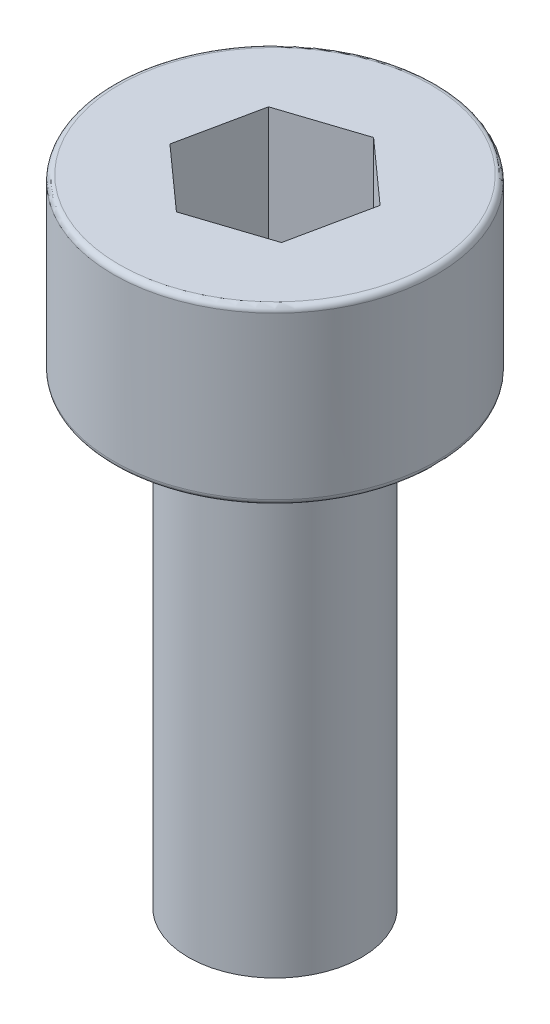
ISO-10303-21;
HEADER;
FILE_DESCRIPTION(('STEP AP214'),'2;1');
FILE_NAME('part.step','',(''),(''),'','','');
FILE_SCHEMA(('AUTOMOTIVE_DESIGN { 1 0 10303 214 1 1 1 1 }'));
ENDSEC;
DATA;
#1=APPLICATION_CONTEXT('core data for automotive mechanical design processes');
#2=APPLICATION_PROTOCOL_DEFINITION('international standard','automotive_design',2000,#1);
#3=PRODUCT_CONTEXT('',#1,'mechanical');
#4=PRODUCT('Part','Part','',(#3));
#5=PRODUCT_RELATED_PRODUCT_CATEGORY('part','',(#4));
#6=PRODUCT_DEFINITION_FORMATION('','',#4);
#7=PRODUCT_DEFINITION_CONTEXT('part definition',#1,'design');
#8=PRODUCT_DEFINITION('design','',#6,#7);
#9=PRODUCT_DEFINITION_SHAPE('','',#8);
#10=(LENGTH_UNIT() NAMED_UNIT(*) SI_UNIT(.MILLI.,.METRE.));
#11=(NAMED_UNIT(*) PLANE_ANGLE_UNIT() SI_UNIT($,.RADIAN.));
#12=(NAMED_UNIT(*) SI_UNIT($,.STERADIAN.) SOLID_ANGLE_UNIT());
#13=UNCERTAINTY_MEASURE_WITH_UNIT(LENGTH_MEASURE(1.E-05),#10,'distance_accuracy_value','');
#14=(GEOMETRIC_REPRESENTATION_CONTEXT(3) GLOBAL_UNCERTAINTY_ASSIGNED_CONTEXT((#13)) GLOBAL_UNIT_ASSIGNED_CONTEXT((#10,
#11,#12)) REPRESENTATION_CONTEXT('',''));
#15=CARTESIAN_POINT('',(0.,0.,0.));
#16=DIRECTION('',(0.,0.,1.));
#17=DIRECTION('',(1.,0.,0.));
#18=AXIS2_PLACEMENT_3D('',#15,#16,#17);
#19=CARTESIAN_POINT('',(1.5,0.,0.));
#20=DIRECTION('',(0.,-1.,0.));
#21=DIRECTION('',(0.,0.,-1.));
#22=AXIS2_PLACEMENT_3D('',#19,#20,#21);
#23=PLANE('',#22);
#24=CARTESIAN_POINT('',(0.,0.,0.));
#25=DIRECTION('',(0.,-1.,0.));
#26=DIRECTION('',(0.,0.,-1.));
#27=AXIS2_PLACEMENT_3D('',#24,#25,#26);
#28=CIRCLE('',#27,1.5);
#29=CARTESIAN_POINT('',(0.,0.,-1.5));
#30=VERTEX_POINT('',#29);
#31=EDGE_CURVE('E141',#30,#30,#28,.T.);
#32=ORIENTED_EDGE('',*,*,#31,.T.);
#33=EDGE_LOOP('',(#32));
#34=FACE_BOUND('',#33,.T.);
#35=ADVANCED_FACE('F39',(#34),#23,.T.);
#36=CARTESIAN_POINT('',(0.,11.,0.));
#37=DIRECTION('',(0.,1.,0.));
#38=DIRECTION('',(0.,0.,1.));
#39=AXIS2_PLACEMENT_3D('',#36,#37,#38);
#40=PLANE('',#39);
#41=CARTESIAN_POINT('',(0.,11.,0.));
#42=DIRECTION('',(0.,1.,0.));
#43=DIRECTION('',(0.,0.,1.));
#44=AXIS2_PLACEMENT_3D('',#41,#42,#43);
#45=CIRCLE('',#44,2.7);
#46=CARTESIAN_POINT('',(0.,11.,2.7));
#47=VERTEX_POINT('',#46);
#48=EDGE_CURVE('E11',#47,#47,#45,.T.);
#49=ORIENTED_EDGE('',*,*,#48,.T.);
#50=EDGE_LOOP('',(#49));
#51=FACE_BOUND('',#50,.T.);
#52=DIRECTION('',(0.950201049984198,0.,-0.311637553271309));
#53=VECTOR('',#52,1.);
#54=CARTESIAN_POINT('',(-0.296201598401666,11.,1.41265634406873));
#55=LINE('',#54,#53);
#56=CARTESIAN_POINT('',(-0.296201598401666,11.,1.41265634406873));
#57=VERTEX_POINT('',#56);
#58=CARTESIAN_POINT('',(1.07529548157994,11.,0.962846280891763));
#59=VERTEX_POINT('',#58);
#60=EDGE_CURVE('E54',#57,#59,#55,.T.);
#61=ORIENTED_EDGE('',*,*,#60,.F.);
#62=DIRECTION('',(0.744986562898279,0.,0.667079471353308));
#63=VECTOR('',#62,1.);
#64=CARTESIAN_POINT('',(-1.3714970799816,11.,0.449810063176967));
#65=LINE('',#64,#63);
#66=CARTESIAN_POINT('',(-1.3714970799816,11.,0.449810063176967));
#67=VERTEX_POINT('',#66);
#68=EDGE_CURVE('E137',#67,#57,#65,.T.);
#69=ORIENTED_EDGE('',*,*,#68,.F.);
#70=DIRECTION('',(-0.205214487085919,0.,0.978717024624617));
#71=VECTOR('',#70,1.);
#72=CARTESIAN_POINT('',(-1.07529548157994,11.,-0.962846280891764));
#73=LINE('',#72,#71);
#74=CARTESIAN_POINT('',(-1.07529548157994,11.,-0.962846280891764));
#75=VERTEX_POINT('',#74);
#76=EDGE_CURVE('E135',#75,#67,#73,.T.);
#77=ORIENTED_EDGE('',*,*,#76,.F.);
#78=DIRECTION('',(-0.950201049984198,0.,0.311637553271309));
#79=VECTOR('',#78,1.);
#80=CARTESIAN_POINT('',(0.296201598401666,11.,-1.41265634406873));
#81=LINE('',#80,#79);
#82=CARTESIAN_POINT('',(0.296201598401666,11.,-1.41265634406873));
#83=VERTEX_POINT('',#82);
#84=EDGE_CURVE('E102',#83,#75,#81,.T.);
#85=ORIENTED_EDGE('',*,*,#84,.F.);
#86=DIRECTION('',(-0.744986562898279,0.,-0.667079471353308));
#87=VECTOR('',#86,1.);
#88=CARTESIAN_POINT('',(1.3714970799816,11.,-0.449810063176967));
#89=LINE('',#88,#87);
#90=CARTESIAN_POINT('',(1.3714970799816,11.,-0.449810063176967));
#91=VERTEX_POINT('',#90);
#92=EDGE_CURVE('E131',#91,#83,#89,.T.);
#93=ORIENTED_EDGE('',*,*,#92,.F.);
#94=DIRECTION('',(0.205214487085918,0.,-0.978717024624617));
#95=VECTOR('',#94,1.);
#96=CARTESIAN_POINT('',(1.07529548157994,11.,0.962846280891763));
#97=LINE('',#96,#95);
#98=EDGE_CURVE('E128',#59,#91,#97,.T.);
#99=ORIENTED_EDGE('',*,*,#98,.F.);
#100=EDGE_LOOP('',(#61,#69,#77,#85,#93,#99));
#101=FACE_BOUND('',#100,.T.);
#102=ADVANCED_FACE('F182',(#51,#101),#40,.T.);
#103=CARTESIAN_POINT('',(0.,0.,0.));
#104=DIRECTION('',(0.,-1.,0.));
#105=DIRECTION('',(0.,0.,-1.));
#106=AXIS2_PLACEMENT_3D('',#103,#104,#105);
#107=CYLINDRICAL_SURFACE('',#106,2.8);
#108=CARTESIAN_POINT('',(0.,8.1,0.));
#109=DIRECTION('',(0.,-1.,0.));
#110=DIRECTION('',(0.,0.,-1.));
#111=AXIS2_PLACEMENT_3D('',#108,#109,#110);
#112=CIRCLE('',#111,2.8);
#113=CARTESIAN_POINT('',(0.,8.1,-2.8));
#114=VERTEX_POINT('',#113);
#115=EDGE_CURVE('E47',#114,#114,#112,.F.);
#116=ORIENTED_EDGE('',*,*,#115,.T.);
#117=EDGE_LOOP('',(#116));
#118=FACE_BOUND('',#117,.T.);
#119=CARTESIAN_POINT('',(0.,10.9,0.));
#120=DIRECTION('',(0.,1.,0.));
#121=DIRECTION('',(0.,0.,1.));
#122=AXIS2_PLACEMENT_3D('',#119,#120,#121);
#123=CIRCLE('',#122,2.8);
#124=CARTESIAN_POINT('',(0.,10.9,2.8));
#125=VERTEX_POINT('',#124);
#126=EDGE_CURVE('E155',#125,#125,#123,.F.);
#127=ORIENTED_EDGE('',*,*,#126,.T.);
#128=EDGE_LOOP('',(#127));
#129=FACE_BOUND('',#128,.T.);
#130=ADVANCED_FACE('F160',(#118,#129),#107,.T.);
#131=CARTESIAN_POINT('',(2.8,8.,0.));
#132=DIRECTION('',(0.,-1.,0.));
#133=DIRECTION('',(0.,0.,-1.));
#134=AXIS2_PLACEMENT_3D('',#131,#132,#133);
#135=PLANE('',#134);
#136=CARTESIAN_POINT('',(0.,8.,0.));
#137=DIRECTION('',(0.,-1.,0.));
#138=DIRECTION('',(0.,0.,-1.));
#139=AXIS2_PLACEMENT_3D('',#136,#137,#138);
#140=CIRCLE('',#139,2.7);
#141=CARTESIAN_POINT('',(0.,8.,-2.7));
#142=VERTEX_POINT('',#141);
#143=EDGE_CURVE('E152',#142,#142,#140,.T.);
#144=ORIENTED_EDGE('',*,*,#143,.T.);
#145=EDGE_LOOP('',(#144));
#146=FACE_BOUND('',#145,.T.);
#147=CARTESIAN_POINT('',(0.,8.,0.));
#148=DIRECTION('',(0.,-1.,0.));
#149=DIRECTION('',(0.,0.,-1.));
#150=AXIS2_PLACEMENT_3D('',#147,#148,#149);
#151=CIRCLE('',#150,1.5);
#152=CARTESIAN_POINT('',(0.,8.,-1.5));
#153=VERTEX_POINT('',#152);
#154=EDGE_CURVE('E149',#153,#153,#151,.T.);
#155=ORIENTED_EDGE('',*,*,#154,.F.);
#156=EDGE_LOOP('',(#155));
#157=FACE_BOUND('',#156,.T.);
#158=ADVANCED_FACE('F168',(#146,#157),#135,.T.);
#159=CARTESIAN_POINT('',(0.,0.,0.));
#160=DIRECTION('',(0.,-1.,0.));
#161=DIRECTION('',(0.,0.,-1.));
#162=AXIS2_PLACEMENT_3D('',#159,#160,#161);
#163=CYLINDRICAL_SURFACE('',#162,1.5);
#164=ORIENTED_EDGE('',*,*,#154,.T.);
#165=EDGE_LOOP('',(#164));
#166=FACE_BOUND('',#165,.T.);
#167=ORIENTED_EDGE('',*,*,#31,.F.);
#168=EDGE_LOOP('',(#167));
#169=FACE_BOUND('',#168,.T.);
#170=ADVANCED_FACE('F171',(#166,#169),#163,.T.);
#171=CARTESIAN_POINT('',(-0.296201598401666,9.,1.41265634406873));
#172=DIRECTION('',(0.311637553271309,0.,0.950201049984198));
#173=DIRECTION('',(0.950201049984198,0.,-0.311637553271309));
#174=AXIS2_PLACEMENT_3D('',#171,#172,#173);
#175=PLANE('',#174);
#176=ORIENTED_EDGE('',*,*,#60,.T.);
#177=DIRECTION('',(0.,1.,0.));
#178=VECTOR('',#177,1.);
#179=CARTESIAN_POINT('',(1.07529548157994,9.,0.962846280891763));
#180=LINE('',#179,#178);
#181=CARTESIAN_POINT('',(1.07529548157994,9.,0.962846280891763));
#182=VERTEX_POINT('',#181);
#183=EDGE_CURVE('E84',#182,#59,#180,.T.);
#184=ORIENTED_EDGE('',*,*,#183,.F.);
#185=DIRECTION('',(0.950201049984198,0.,-0.311637553271309));
#186=VECTOR('',#185,1.);
#187=CARTESIAN_POINT('',(-0.296201598401666,9.,1.41265634406873));
#188=LINE('',#187,#186);
#189=CARTESIAN_POINT('',(-0.296201598401666,9.,1.41265634406873));
#190=VERTEX_POINT('',#189);
#191=EDGE_CURVE('E139',#190,#182,#188,.T.);
#192=ORIENTED_EDGE('',*,*,#191,.F.);
#193=DIRECTION('',(0.,1.,0.));
#194=VECTOR('',#193,1.);
#195=CARTESIAN_POINT('',(-0.296201598401666,9.,1.41265634406873));
#196=LINE('',#195,#194);
#197=EDGE_CURVE('E62',#190,#57,#196,.T.);
#198=ORIENTED_EDGE('',*,*,#197,.T.);
#199=EDGE_LOOP('',(#176,#184,#192,#198));
#200=FACE_BOUND('',#199,.T.);
#201=ADVANCED_FACE('F177',(#200),#175,.F.);
#202=CARTESIAN_POINT('',(-1.3714970799816,9.,0.449810063176967));
#203=DIRECTION('',(-0.667079471353308,0.,0.744986562898279));
#204=DIRECTION('',(0.744986562898279,0.,0.667079471353308));
#205=AXIS2_PLACEMENT_3D('',#202,#203,#204);
#206=PLANE('',#205);
#207=ORIENTED_EDGE('',*,*,#68,.T.);
#208=ORIENTED_EDGE('',*,*,#197,.F.);
#209=DIRECTION('',(0.744986562898279,0.,0.667079471353308));
#210=VECTOR('',#209,1.);
#211=CARTESIAN_POINT('',(-1.3714970799816,9.,0.449810063176967));
#212=LINE('',#211,#210);
#213=CARTESIAN_POINT('',(-1.3714970799816,9.,0.449810063176967));
#214=VERTEX_POINT('',#213);
#215=EDGE_CURVE('E114',#214,#190,#212,.T.);
#216=ORIENTED_EDGE('',*,*,#215,.F.);
#217=DIRECTION('',(0.,1.,0.));
#218=VECTOR('',#217,1.);
#219=CARTESIAN_POINT('',(-1.3714970799816,9.,0.449810063176967));
#220=LINE('',#219,#218);
#221=EDGE_CURVE('E106',#214,#67,#220,.T.);
#222=ORIENTED_EDGE('',*,*,#221,.T.);
#223=EDGE_LOOP('',(#207,#208,#216,#222));
#224=FACE_BOUND('',#223,.T.);
#225=ADVANCED_FACE('F194',(#224),#206,.F.);
#226=CARTESIAN_POINT('',(-1.07529548157994,9.,-0.962846280891764));
#227=DIRECTION('',(-0.978717024624617,0.,-0.205214487085919));
#228=DIRECTION('',(-0.205214487085919,0.,0.978717024624617));
#229=AXIS2_PLACEMENT_3D('',#226,#227,#228);
#230=PLANE('',#229);
#231=ORIENTED_EDGE('',*,*,#76,.T.);
#232=ORIENTED_EDGE('',*,*,#221,.F.);
#233=DIRECTION('',(-0.205214487085919,0.,0.978717024624617));
#234=VECTOR('',#233,1.);
#235=CARTESIAN_POINT('',(-1.07529548157994,9.,-0.962846280891764));
#236=LINE('',#235,#234);
#237=CARTESIAN_POINT('',(-1.07529548157994,9.,-0.962846280891764));
#238=VERTEX_POINT('',#237);
#239=EDGE_CURVE('E110',#238,#214,#236,.T.);
#240=ORIENTED_EDGE('',*,*,#239,.F.);
#241=DIRECTION('',(0.,1.,0.));
#242=VECTOR('',#241,1.);
#243=CARTESIAN_POINT('',(-1.07529548157994,9.,-0.962846280891764));
#244=LINE('',#243,#242);
#245=EDGE_CURVE('E95',#238,#75,#244,.T.);
#246=ORIENTED_EDGE('',*,*,#245,.T.);
#247=EDGE_LOOP('',(#231,#232,#240,#246));
#248=FACE_BOUND('',#247,.T.);
#249=ADVANCED_FACE('F111',(#248),#230,.F.);
#250=CARTESIAN_POINT('',(0.296201598401666,9.,-1.41265634406873));
#251=DIRECTION('',(-0.311637553271309,0.,-0.950201049984198));
#252=DIRECTION('',(-0.950201049984198,0.,0.311637553271309));
#253=AXIS2_PLACEMENT_3D('',#250,#251,#252);
#254=PLANE('',#253);
#255=ORIENTED_EDGE('',*,*,#84,.T.);
#256=ORIENTED_EDGE('',*,*,#245,.F.);
#257=DIRECTION('',(-0.950201049984198,0.,0.311637553271309));
#258=VECTOR('',#257,1.);
#259=CARTESIAN_POINT('',(0.296201598401666,9.,-1.41265634406873));
#260=LINE('',#259,#258);
#261=CARTESIAN_POINT('',(0.296201598401666,9.,-1.41265634406873));
#262=VERTEX_POINT('',#261);
#263=EDGE_CURVE('E99',#262,#238,#260,.T.);
#264=ORIENTED_EDGE('',*,*,#263,.F.);
#265=DIRECTION('',(0.,1.,0.));
#266=VECTOR('',#265,1.);
#267=CARTESIAN_POINT('',(0.296201598401666,9.,-1.41265634406873));
#268=LINE('',#267,#266);
#269=EDGE_CURVE('E107',#262,#83,#268,.T.);
#270=ORIENTED_EDGE('',*,*,#269,.T.);
#271=EDGE_LOOP('',(#255,#256,#264,#270));
#272=FACE_BOUND('',#271,.T.);
#273=ADVANCED_FACE('F97',(#272),#254,.F.);
#274=CARTESIAN_POINT('',(1.3714970799816,9.,-0.449810063176967));
#275=DIRECTION('',(0.667079471353308,0.,-0.744986562898279));
#276=DIRECTION('',(-0.744986562898279,0.,-0.667079471353308));
#277=AXIS2_PLACEMENT_3D('',#274,#275,#276);
#278=PLANE('',#277);
#279=ORIENTED_EDGE('',*,*,#92,.T.);
#280=ORIENTED_EDGE('',*,*,#269,.F.);
#281=DIRECTION('',(-0.744986562898279,0.,-0.667079471353308));
#282=VECTOR('',#281,1.);
#283=CARTESIAN_POINT('',(1.3714970799816,9.,-0.449810063176967));
#284=LINE('',#283,#282);
#285=CARTESIAN_POINT('',(1.3714970799816,9.,-0.449810063176967));
#286=VERTEX_POINT('',#285);
#287=EDGE_CURVE('E120',#286,#262,#284,.T.);
#288=ORIENTED_EDGE('',*,*,#287,.F.);
#289=DIRECTION('',(0.,1.,0.));
#290=VECTOR('',#289,1.);
#291=CARTESIAN_POINT('',(1.3714970799816,9.,-0.449810063176967));
#292=LINE('',#291,#290);
#293=EDGE_CURVE('E144',#286,#91,#292,.T.);
#294=ORIENTED_EDGE('',*,*,#293,.T.);
#295=EDGE_LOOP('',(#279,#280,#288,#294));
#296=FACE_BOUND('',#295,.T.);
#297=ADVANCED_FACE('F198',(#296),#278,.F.);
#298=CARTESIAN_POINT('',(1.07529548157994,9.,0.962846280891763));
#299=DIRECTION('',(0.978717024624617,0.,0.205214487085918));
#300=DIRECTION('',(0.205214487085919,0.,-0.978717024624617));
#301=AXIS2_PLACEMENT_3D('',#298,#299,#300);
#302=PLANE('',#301);
#303=ORIENTED_EDGE('',*,*,#98,.T.);
#304=ORIENTED_EDGE('',*,*,#293,.F.);
#305=DIRECTION('',(0.205214487085918,0.,-0.978717024624617));
#306=VECTOR('',#305,1.);
#307=CARTESIAN_POINT('',(1.07529548157994,9.,0.962846280891763));
#308=LINE('',#307,#306);
#309=EDGE_CURVE('E122',#182,#286,#308,.T.);
#310=ORIENTED_EDGE('',*,*,#309,.F.);
#311=ORIENTED_EDGE('',*,*,#183,.T.);
#312=EDGE_LOOP('',(#303,#304,#310,#311));
#313=FACE_BOUND('',#312,.T.);
#314=ADVANCED_FACE('F195',(#313),#302,.F.);
#315=CARTESIAN_POINT('',(0.,9.,0.));
#316=DIRECTION('',(0.,1.,0.));
#317=DIRECTION('',(0.,0.,1.));
#318=AXIS2_PLACEMENT_3D('',#315,#316,#317);
#319=PLANE('',#318);
#320=ORIENTED_EDGE('',*,*,#191,.T.);
#321=ORIENTED_EDGE('',*,*,#309,.T.);
#322=ORIENTED_EDGE('',*,*,#287,.T.);
#323=ORIENTED_EDGE('',*,*,#263,.T.);
#324=ORIENTED_EDGE('',*,*,#239,.T.);
#325=ORIENTED_EDGE('',*,*,#215,.T.);
#326=EDGE_LOOP('',(#320,#321,#322,#323,#324,#325));
#327=FACE_BOUND('',#326,.T.);
#328=ADVANCED_FACE('F117',(#327),#319,.T.);
#329=CARTESIAN_POINT('',(0.,8.1,0.));
#330=DIRECTION('',(0.,-1.,0.));
#331=DIRECTION('',(0.,0.,-1.));
#332=AXIS2_PLACEMENT_3D('',#329,#330,#331);
#333=TOROIDAL_SURFACE('',#332,2.7,0.1);
#334=ORIENTED_EDGE('',*,*,#115,.F.);
#335=EDGE_LOOP('',(#334));
#336=FACE_BOUND('',#335,.T.);
#337=ORIENTED_EDGE('',*,*,#143,.F.);
#338=EDGE_LOOP('',(#337));
#339=FACE_BOUND('',#338,.T.);
#340=ADVANCED_FACE('F163',(#336,#339),#333,.T.);
#341=CARTESIAN_POINT('',(0.,10.9,0.));
#342=DIRECTION('',(0.,1.,0.));
#343=DIRECTION('',(0.,0.,1.));
#344=AXIS2_PLACEMENT_3D('',#341,#342,#343);
#345=TOROIDAL_SURFACE('',#344,2.7,0.1);
#346=ORIENTED_EDGE('',*,*,#48,.F.);
#347=EDGE_LOOP('',(#346));
#348=FACE_BOUND('',#347,.T.);
#349=ORIENTED_EDGE('',*,*,#126,.F.);
#350=EDGE_LOOP('',(#349));
#351=FACE_BOUND('',#350,.T.);
#352=ADVANCED_FACE('F41',(#348,#351),#345,.T.);
#353=CLOSED_SHELL('',(#35,#102,#130,#158,#170,#201,#225,#249,#273,#297,#314,#328,#340,#352));
#354=MANIFOLD_SOLID_BREP('B2',#353);
#355=ADVANCED_BREP_SHAPE_REPRESENTATION('',(#18,#354),#14);
#356=SHAPE_DEFINITION_REPRESENTATION(#9,#355);
ENDSEC;
END-ISO-10303-21;
